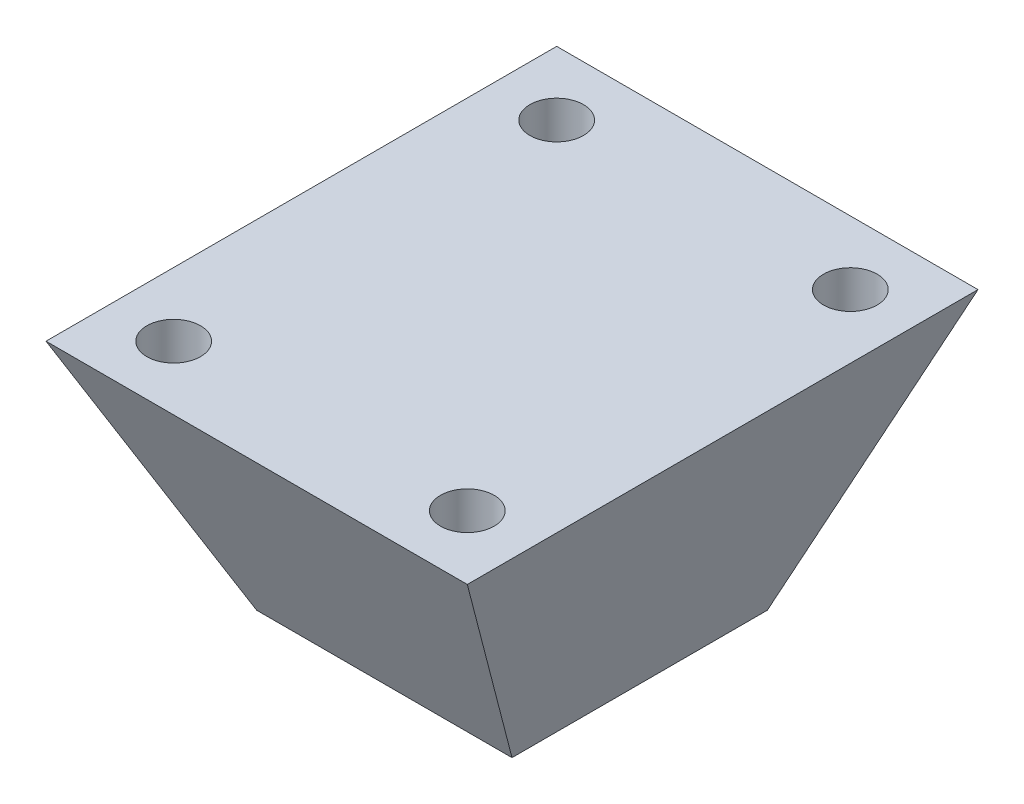
ISO-10303-21;
HEADER;
FILE_DESCRIPTION(('STEP AP214'),'2;1');
FILE_NAME('part.step','',(''),(''),'','','');
FILE_SCHEMA(('AUTOMOTIVE_DESIGN { 1 0 10303 214 1 1 1 1 }'));
ENDSEC;
DATA;
#1=APPLICATION_CONTEXT('core data for automotive mechanical design processes');
#2=APPLICATION_PROTOCOL_DEFINITION('international standard','automotive_design',2000,#1);
#3=PRODUCT_CONTEXT('',#1,'mechanical');
#4=PRODUCT('Part','Part','',(#3));
#5=PRODUCT_RELATED_PRODUCT_CATEGORY('part','',(#4));
#6=PRODUCT_DEFINITION_FORMATION('','',#4);
#7=PRODUCT_DEFINITION_CONTEXT('part definition',#1,'design');
#8=PRODUCT_DEFINITION('design','',#6,#7);
#9=PRODUCT_DEFINITION_SHAPE('','',#8);
#10=(LENGTH_UNIT() NAMED_UNIT(*) SI_UNIT(.MILLI.,.METRE.));
#11=(NAMED_UNIT(*) PLANE_ANGLE_UNIT() SI_UNIT($,.RADIAN.));
#12=(NAMED_UNIT(*) SI_UNIT($,.STERADIAN.) SOLID_ANGLE_UNIT());
#13=UNCERTAINTY_MEASURE_WITH_UNIT(LENGTH_MEASURE(1.E-05),#10,'distance_accuracy_value','');
#14=(GEOMETRIC_REPRESENTATION_CONTEXT(3) GLOBAL_UNCERTAINTY_ASSIGNED_CONTEXT((#13)) GLOBAL_UNIT_ASSIGNED_CONTEXT((#10,
#11,#12)) REPRESENTATION_CONTEXT('',''));
#15=CARTESIAN_POINT('',(0.,0.,0.));
#16=DIRECTION('',(0.,0.,1.));
#17=DIRECTION('',(1.,0.,0.));
#18=AXIS2_PLACEMENT_3D('',#15,#16,#17);
#19=CARTESIAN_POINT('',(0.,0.,0.));
#20=DIRECTION('',(0.,1.,0.));
#21=DIRECTION('',(0.,0.,1.));
#22=AXIS2_PLACEMENT_3D('',#19,#20,#21);
#23=PLANE('',#22);
#24=CARTESIAN_POINT('',(4.99999999999999,0.,-5.));
#25=DIRECTION('',(0.,1.,0.));
#26=DIRECTION('',(0.,0.,1.));
#27=AXIS2_PLACEMENT_3D('',#24,#25,#26);
#28=CIRCLE('',#27,2.1);
#29=CARTESIAN_POINT('',(4.99999999999999,0.,-2.9));
#30=VERTEX_POINT('',#29);
#31=EDGE_CURVE('E134',#30,#30,#28,.F.);
#32=ORIENTED_EDGE('',*,*,#31,.F.);
#33=EDGE_LOOP('',(#32));
#34=FACE_BOUND('',#33,.T.);
#35=CARTESIAN_POINT('',(-5.,0.,-5.));
#36=DIRECTION('',(0.,1.,0.));
#37=DIRECTION('',(0.,0.,1.));
#38=AXIS2_PLACEMENT_3D('',#35,#36,#37);
#39=CIRCLE('',#38,2.1);
#40=CARTESIAN_POINT('',(-5.,0.,-2.9));
#41=VERTEX_POINT('',#40);
#42=EDGE_CURVE('E115',#41,#41,#39,.T.);
#43=ORIENTED_EDGE('',*,*,#42,.T.);
#44=EDGE_LOOP('',(#43));
#45=FACE_BOUND('',#44,.T.);
#46=DIRECTION('',(0.,0.,1.));
#47=VECTOR('',#46,1.);
#48=CARTESIAN_POINT('',(-10.,0.,0.));
#49=LINE('',#48,#47);
#50=CARTESIAN_POINT('',(-10.,0.,-10.));
#51=VERTEX_POINT('',#50);
#52=CARTESIAN_POINT('',(-10.,0.,10.));
#53=VERTEX_POINT('',#52);
#54=EDGE_CURVE('E51',#51,#53,#49,.T.);
#55=ORIENTED_EDGE('',*,*,#54,.F.);
#56=DIRECTION('',(1.,0.,0.));
#57=VECTOR('',#56,1.);
#58=CARTESIAN_POINT('',(0.,0.,-10.));
#59=LINE('',#58,#57);
#60=CARTESIAN_POINT('',(10.,0.,-10.));
#61=VERTEX_POINT('',#60);
#62=EDGE_CURVE('E92',#51,#61,#59,.T.);
#63=ORIENTED_EDGE('',*,*,#62,.T.);
#64=DIRECTION('',(0.,0.,-1.));
#65=VECTOR('',#64,1.);
#66=CARTESIAN_POINT('',(10.,0.,0.));
#67=LINE('',#66,#65);
#68=CARTESIAN_POINT('',(10.,0.,10.));
#69=VERTEX_POINT('',#68);
#70=EDGE_CURVE('E89',#69,#61,#67,.T.);
#71=ORIENTED_EDGE('',*,*,#70,.F.);
#72=DIRECTION('',(-1.,0.,0.));
#73=VECTOR('',#72,1.);
#74=CARTESIAN_POINT('',(0.,0.,10.));
#75=LINE('',#74,#73);
#76=EDGE_CURVE('E58',#69,#53,#75,.T.);
#77=ORIENTED_EDGE('',*,*,#76,.T.);
#78=EDGE_LOOP('',(#55,#63,#71,#77));
#79=FACE_BOUND('',#78,.T.);
#80=CARTESIAN_POINT('',(5.,0.,5.));
#81=DIRECTION('',(0.,1.,0.));
#82=DIRECTION('',(0.,0.,1.));
#83=AXIS2_PLACEMENT_3D('',#80,#81,#82);
#84=CIRCLE('',#83,2.1);
#85=CARTESIAN_POINT('',(5.,0.,7.1));
#86=VERTEX_POINT('',#85);
#87=EDGE_CURVE('E128',#86,#86,#84,.T.);
#88=ORIENTED_EDGE('',*,*,#87,.T.);
#89=EDGE_LOOP('',(#88));
#90=FACE_BOUND('',#89,.T.);
#91=CARTESIAN_POINT('',(-5.,0.,5.));
#92=DIRECTION('',(0.,1.,0.));
#93=DIRECTION('',(0.,0.,1.));
#94=AXIS2_PLACEMENT_3D('',#91,#92,#93);
#95=CIRCLE('',#94,2.1);
#96=CARTESIAN_POINT('',(-5.,0.,7.1));
#97=VERTEX_POINT('',#96);
#98=EDGE_CURVE('E121',#97,#97,#95,.F.);
#99=ORIENTED_EDGE('',*,*,#98,.F.);
#100=EDGE_LOOP('',(#99));
#101=FACE_BOUND('',#100,.T.);
#102=ADVANCED_FACE('F37',(#34,#45,#79,#90,#101),#23,.F.);
#103=CARTESIAN_POINT('',(0.,-4.,-8.));
#104=DIRECTION('',(0.,0.447213595499958,0.894427190999916));
#105=DIRECTION('',(0.,-0.894427190999916,0.447213595499958));
#106=AXIS2_PLACEMENT_3D('',#103,#104,#105);
#107=PLANE('',#106);
#108=DIRECTION('',(0.279134538107027,-0.858875501867774,0.429437750933887));
#109=VECTOR('',#108,1.);
#110=CARTESIAN_POINT('',(-8.02213001383125,-6.08575380359613,-6.95712309820194));
#111=LINE('',#110,#109);
#112=CARTESIAN_POINT('',(-16.5,20.,-20.));
#113=VERTEX_POINT('',#112);
#114=EDGE_CURVE('E109',#113,#51,#111,.T.);
#115=ORIENTED_EDGE('',*,*,#114,.F.);
#116=DIRECTION('',(1.,0.,0.));
#117=VECTOR('',#116,1.);
#118=CARTESIAN_POINT('',(0.,20.,-20.));
#119=LINE('',#118,#117);
#120=CARTESIAN_POINT('',(16.5,20.,-20.));
#121=VERTEX_POINT('',#120);
#122=EDGE_CURVE('E88',#113,#121,#119,.T.);
#123=ORIENTED_EDGE('',*,*,#122,.T.);
#124=DIRECTION('',(-0.279134538107027,-0.858875501867774,0.429437750933887));
#125=VECTOR('',#124,1.);
#126=CARTESIAN_POINT('',(8.02213001383125,-6.08575380359613,-6.95712309820194));
#127=LINE('',#126,#125);
#128=EDGE_CURVE('E98',#121,#61,#127,.T.);
#129=ORIENTED_EDGE('',*,*,#128,.T.);
#130=ORIENTED_EDGE('',*,*,#62,.F.);
#131=EDGE_LOOP('',(#115,#123,#129,#130));
#132=FACE_BOUND('',#131,.T.);
#133=ADVANCED_FACE('F103',(#132),#107,.F.);
#134=CARTESIAN_POINT('',(0.,-4.,8.));
#135=DIRECTION('',(0.,0.447213595499958,-0.894427190999916));
#136=DIRECTION('',(0.,-0.894427190999916,-0.447213595499958));
#137=AXIS2_PLACEMENT_3D('',#134,#135,#136);
#138=PLANE('',#137);
#139=DIRECTION('',(-0.279134538107027,0.858875501867774,0.429437750933887));
#140=VECTOR('',#139,1.);
#141=CARTESIAN_POINT('',(-8.02213001383126,-6.08575380359613,6.95712309820193));
#142=LINE('',#141,#140);
#143=CARTESIAN_POINT('',(-16.5,20.,20.));
#144=VERTEX_POINT('',#143);
#145=EDGE_CURVE('E11',#53,#144,#142,.T.);
#146=ORIENTED_EDGE('',*,*,#145,.F.);
#147=ORIENTED_EDGE('',*,*,#76,.F.);
#148=DIRECTION('',(0.279134538107027,0.858875501867774,0.429437750933887));
#149=VECTOR('',#148,1.);
#150=CARTESIAN_POINT('',(8.02213001383126,-6.08575380359613,6.95712309820194));
#151=LINE('',#150,#149);
#152=CARTESIAN_POINT('',(16.5,20.,20.));
#153=VERTEX_POINT('',#152);
#154=EDGE_CURVE('E45',#69,#153,#151,.T.);
#155=ORIENTED_EDGE('',*,*,#154,.T.);
#156=DIRECTION('',(1.,0.,0.));
#157=VECTOR('',#156,1.);
#158=CARTESIAN_POINT('',(0.,20.,20.));
#159=LINE('',#158,#157);
#160=EDGE_CURVE('E80',#144,#153,#159,.T.);
#161=ORIENTED_EDGE('',*,*,#160,.F.);
#162=EDGE_LOOP('',(#146,#147,#155,#161));
#163=FACE_BOUND('',#162,.T.);
#164=ADVANCED_FACE('F81',(#163),#138,.F.);
#165=CARTESIAN_POINT('',(0.,20.,0.));
#166=DIRECTION('',(0.,1.,0.));
#167=DIRECTION('',(0.,0.,1.));
#168=AXIS2_PLACEMENT_3D('',#165,#166,#167);
#169=PLANE('',#168);
#170=CARTESIAN_POINT('',(11.5,20.,-15.));
#171=DIRECTION('',(0.,1.,0.));
#172=DIRECTION('',(0.,0.,-1.));
#173=AXIS2_PLACEMENT_3D('',#170,#171,#172);
#174=CIRCLE('',#173,2.1);
#175=CARTESIAN_POINT('',(11.5,20.,-17.1));
#176=VERTEX_POINT('',#175);
#177=EDGE_CURVE('E148',#176,#176,#174,.T.);
#178=ORIENTED_EDGE('',*,*,#177,.F.);
#179=EDGE_LOOP('',(#178));
#180=FACE_BOUND('',#179,.T.);
#181=CARTESIAN_POINT('',(11.5,20.,15.));
#182=DIRECTION('',(0.,1.,0.));
#183=DIRECTION('',(0.,0.,1.));
#184=AXIS2_PLACEMENT_3D('',#181,#182,#183);
#185=CIRCLE('',#184,2.1);
#186=CARTESIAN_POINT('',(11.5,20.,17.1));
#187=VERTEX_POINT('',#186);
#188=EDGE_CURVE('E154',#187,#187,#185,.T.);
#189=ORIENTED_EDGE('',*,*,#188,.F.);
#190=EDGE_LOOP('',(#189));
#191=FACE_BOUND('',#190,.T.);
#192=CARTESIAN_POINT('',(-11.5,20.,15.));
#193=DIRECTION('',(0.,1.,0.));
#194=DIRECTION('',(0.,0.,-1.));
#195=AXIS2_PLACEMENT_3D('',#192,#193,#194);
#196=CIRCLE('',#195,2.1);
#197=CARTESIAN_POINT('',(-11.5,20.,12.9));
#198=VERTEX_POINT('',#197);
#199=EDGE_CURVE('E142',#198,#198,#196,.T.);
#200=ORIENTED_EDGE('',*,*,#199,.F.);
#201=EDGE_LOOP('',(#200));
#202=FACE_BOUND('',#201,.T.);
#203=CARTESIAN_POINT('',(-11.5,20.,-15.));
#204=DIRECTION('',(0.,1.,0.));
#205=DIRECTION('',(0.,0.,1.));
#206=AXIS2_PLACEMENT_3D('',#203,#204,#205);
#207=CIRCLE('',#206,2.1);
#208=CARTESIAN_POINT('',(-11.5,20.,-12.9));
#209=VERTEX_POINT('',#208);
#210=EDGE_CURVE('E139',#209,#209,#207,.T.);
#211=ORIENTED_EDGE('',*,*,#210,.F.);
#212=EDGE_LOOP('',(#211));
#213=FACE_BOUND('',#212,.T.);
#214=DIRECTION('',(0.,0.,1.));
#215=VECTOR('',#214,1.);
#216=CARTESIAN_POINT('',(-16.5,20.,0.));
#217=LINE('',#216,#215);
#218=EDGE_CURVE('E77',#113,#144,#217,.T.);
#219=ORIENTED_EDGE('',*,*,#218,.T.);
#220=ORIENTED_EDGE('',*,*,#160,.T.);
#221=DIRECTION('',(0.,0.,1.));
#222=VECTOR('',#221,1.);
#223=CARTESIAN_POINT('',(16.5,20.,0.));
#224=LINE('',#223,#222);
#225=EDGE_CURVE('E85',#121,#153,#224,.T.);
#226=ORIENTED_EDGE('',*,*,#225,.F.);
#227=ORIENTED_EDGE('',*,*,#122,.F.);
#228=EDGE_LOOP('',(#219,#220,#226,#227));
#229=FACE_BOUND('',#228,.T.);
#230=ADVANCED_FACE('F39',(#180,#191,#202,#213,#229),#169,.T.);
#231=CARTESIAN_POINT('',(9.04465799886941,-2.93951384963257,0.));
#232=DIRECTION('',(0.951034068730948,-0.309086072337559,0.));
#233=DIRECTION('',(0.309086072337559,0.951034068730948,0.));
#234=AXIS2_PLACEMENT_3D('',#231,#232,#233);
#235=PLANE('',#234);
#236=ORIENTED_EDGE('',*,*,#154,.F.);
#237=ORIENTED_EDGE('',*,*,#70,.T.);
#238=ORIENTED_EDGE('',*,*,#128,.F.);
#239=ORIENTED_EDGE('',*,*,#225,.T.);
#240=EDGE_LOOP('',(#236,#237,#238,#239));
#241=FACE_BOUND('',#240,.T.);
#242=ADVANCED_FACE('F105',(#241),#235,.T.);
#243=CARTESIAN_POINT('',(-9.04465799886941,-2.93951384963257,0.));
#244=DIRECTION('',(-0.951034068730948,-0.309086072337559,0.));
#245=DIRECTION('',(-0.309086072337559,0.951034068730948,0.));
#246=AXIS2_PLACEMENT_3D('',#243,#244,#245);
#247=PLANE('',#246);
#248=ORIENTED_EDGE('',*,*,#114,.T.);
#249=ORIENTED_EDGE('',*,*,#54,.T.);
#250=ORIENTED_EDGE('',*,*,#145,.T.);
#251=ORIENTED_EDGE('',*,*,#218,.F.);
#252=EDGE_LOOP('',(#248,#249,#250,#251));
#253=FACE_BOUND('',#252,.T.);
#254=ADVANCED_FACE('F75',(#253),#247,.T.);
#255=CARTESIAN_POINT('',(-5.,5.7,-5.));
#256=DIRECTION('',(0.,-1.,0.));
#257=DIRECTION('',(0.,0.,-1.));
#258=AXIS2_PLACEMENT_3D('',#255,#256,#257);
#259=CYLINDRICAL_SURFACE('',#258,2.1);
#260=CARTESIAN_POINT('',(-5.,5.7,-5.));
#261=DIRECTION('',(0.,1.,0.));
#262=DIRECTION('',(0.,0.,1.));
#263=AXIS2_PLACEMENT_3D('',#260,#261,#262);
#264=CIRCLE('',#263,2.1);
#265=CARTESIAN_POINT('',(-5.,5.7,-2.9));
#266=VERTEX_POINT('',#265);
#267=EDGE_CURVE('E114',#266,#266,#264,.T.);
#268=ORIENTED_EDGE('',*,*,#267,.T.);
#269=EDGE_LOOP('',(#268));
#270=FACE_BOUND('',#269,.T.);
#271=ORIENTED_EDGE('',*,*,#42,.F.);
#272=EDGE_LOOP('',(#271));
#273=FACE_BOUND('',#272,.T.);
#274=ADVANCED_FACE('F202',(#270,#273),#259,.F.);
#275=CARTESIAN_POINT('',(0.,5.7,0.));
#276=DIRECTION('',(0.,1.,0.));
#277=DIRECTION('',(0.,0.,1.));
#278=AXIS2_PLACEMENT_3D('',#275,#276,#277);
#279=PLANE('',#278);
#280=ORIENTED_EDGE('',*,*,#267,.F.);
#281=EDGE_LOOP('',(#280));
#282=FACE_BOUND('',#281,.T.);
#283=ADVANCED_FACE('F205',(#282),#279,.F.);
#284=CARTESIAN_POINT('',(4.99999999999999,5.7,-5.));
#285=DIRECTION('',(0.,-1.,0.));
#286=DIRECTION('',(0.,0.,-1.));
#287=AXIS2_PLACEMENT_3D('',#284,#285,#286);
#288=CYLINDRICAL_SURFACE('',#287,2.1);
#289=CARTESIAN_POINT('',(4.99999999999999,5.7,-5.));
#290=DIRECTION('',(0.,1.,0.));
#291=DIRECTION('',(0.,0.,1.));
#292=AXIS2_PLACEMENT_3D('',#289,#290,#291);
#293=CIRCLE('',#292,2.1);
#294=CARTESIAN_POINT('',(4.99999999999999,5.7,-2.9));
#295=VERTEX_POINT('',#294);
#296=EDGE_CURVE('E118',#295,#295,#293,.F.);
#297=ORIENTED_EDGE('',*,*,#296,.F.);
#298=EDGE_LOOP('',(#297));
#299=FACE_BOUND('',#298,.T.);
#300=ORIENTED_EDGE('',*,*,#31,.T.);
#301=EDGE_LOOP('',(#300));
#302=FACE_BOUND('',#301,.T.);
#303=ADVANCED_FACE('F209',(#299,#302),#288,.F.);
#304=CARTESIAN_POINT('',(0.,5.7,0.));
#305=DIRECTION('',(0.,1.,0.));
#306=DIRECTION('',(0.,0.,1.));
#307=AXIS2_PLACEMENT_3D('',#304,#305,#306);
#308=PLANE('',#307);
#309=ORIENTED_EDGE('',*,*,#296,.T.);
#310=EDGE_LOOP('',(#309));
#311=FACE_BOUND('',#310,.T.);
#312=ADVANCED_FACE('F218',(#311),#308,.F.);
#313=CARTESIAN_POINT('',(5.,5.7,5.));
#314=DIRECTION('',(0.,-1.,0.));
#315=DIRECTION('',(0.,0.,-1.));
#316=AXIS2_PLACEMENT_3D('',#313,#314,#315);
#317=CYLINDRICAL_SURFACE('',#316,2.1);
#318=CARTESIAN_POINT('',(5.,5.7,5.));
#319=DIRECTION('',(0.,1.,0.));
#320=DIRECTION('',(0.,0.,1.));
#321=AXIS2_PLACEMENT_3D('',#318,#319,#320);
#322=CIRCLE('',#321,2.1);
#323=CARTESIAN_POINT('',(5.,5.7,7.1));
#324=VERTEX_POINT('',#323);
#325=EDGE_CURVE('E131',#324,#324,#322,.T.);
#326=ORIENTED_EDGE('',*,*,#325,.T.);
#327=EDGE_LOOP('',(#326));
#328=FACE_BOUND('',#327,.T.);
#329=ORIENTED_EDGE('',*,*,#87,.F.);
#330=EDGE_LOOP('',(#329));
#331=FACE_BOUND('',#330,.T.);
#332=ADVANCED_FACE('F215',(#328,#331),#317,.F.);
#333=CARTESIAN_POINT('',(0.,5.7,0.));
#334=DIRECTION('',(0.,1.,0.));
#335=DIRECTION('',(0.,0.,1.));
#336=AXIS2_PLACEMENT_3D('',#333,#334,#335);
#337=PLANE('',#336);
#338=ORIENTED_EDGE('',*,*,#325,.F.);
#339=EDGE_LOOP('',(#338));
#340=FACE_BOUND('',#339,.T.);
#341=ADVANCED_FACE('F212',(#340),#337,.F.);
#342=CARTESIAN_POINT('',(-5.,5.7,5.));
#343=DIRECTION('',(0.,-1.,0.));
#344=DIRECTION('',(0.,0.,-1.));
#345=AXIS2_PLACEMENT_3D('',#342,#343,#344);
#346=CYLINDRICAL_SURFACE('',#345,2.1);
#347=CARTESIAN_POINT('',(-5.,5.7,5.));
#348=DIRECTION('',(0.,1.,0.));
#349=DIRECTION('',(0.,0.,1.));
#350=AXIS2_PLACEMENT_3D('',#347,#348,#349);
#351=CIRCLE('',#350,2.1);
#352=CARTESIAN_POINT('',(-5.,5.7,7.1));
#353=VERTEX_POINT('',#352);
#354=EDGE_CURVE('E124',#353,#353,#351,.F.);
#355=ORIENTED_EDGE('',*,*,#354,.F.);
#356=EDGE_LOOP('',(#355));
#357=FACE_BOUND('',#356,.T.);
#358=ORIENTED_EDGE('',*,*,#98,.T.);
#359=EDGE_LOOP('',(#358));
#360=FACE_BOUND('',#359,.T.);
#361=ADVANCED_FACE('F182',(#357,#360),#346,.F.);
#362=CARTESIAN_POINT('',(0.,5.7,0.));
#363=DIRECTION('',(0.,1.,0.));
#364=DIRECTION('',(0.,0.,1.));
#365=AXIS2_PLACEMENT_3D('',#362,#363,#364);
#366=PLANE('',#365);
#367=ORIENTED_EDGE('',*,*,#354,.T.);
#368=EDGE_LOOP('',(#367));
#369=FACE_BOUND('',#368,.T.);
#370=ADVANCED_FACE('F173',(#369),#366,.F.);
#371=CARTESIAN_POINT('',(-11.5,14.3,-15.));
#372=DIRECTION('',(0.,1.,0.));
#373=DIRECTION('',(0.,0.,1.));
#374=AXIS2_PLACEMENT_3D('',#371,#372,#373);
#375=CYLINDRICAL_SURFACE('',#374,2.1);
#376=CARTESIAN_POINT('',(-11.5,14.3,-15.));
#377=DIRECTION('',(0.,1.,0.));
#378=DIRECTION('',(0.,0.,1.));
#379=AXIS2_PLACEMENT_3D('',#376,#377,#378);
#380=CIRCLE('',#379,2.1);
#381=CARTESIAN_POINT('',(-11.5,14.3,-12.9));
#382=VERTEX_POINT('',#381);
#383=EDGE_CURVE('E125',#382,#382,#380,.T.);
#384=ORIENTED_EDGE('',*,*,#383,.F.);
#385=EDGE_LOOP('',(#384));
#386=FACE_BOUND('',#385,.T.);
#387=ORIENTED_EDGE('',*,*,#210,.T.);
#388=EDGE_LOOP('',(#387));
#389=FACE_BOUND('',#388,.T.);
#390=ADVANCED_FACE('F170',(#386,#389),#375,.F.);
#391=CARTESIAN_POINT('',(-11.5,14.3,-15.));
#392=DIRECTION('',(0.,1.,0.));
#393=DIRECTION('',(0.,0.,1.));
#394=AXIS2_PLACEMENT_3D('',#391,#392,#393);
#395=PLANE('',#394);
#396=ORIENTED_EDGE('',*,*,#383,.T.);
#397=EDGE_LOOP('',(#396));
#398=FACE_BOUND('',#397,.T.);
#399=ADVANCED_FACE('F172',(#398),#395,.T.);
#400=CARTESIAN_POINT('',(-11.5,14.3,15.));
#401=DIRECTION('',(0.,1.,0.));
#402=DIRECTION('',(0.,0.,1.));
#403=AXIS2_PLACEMENT_3D('',#400,#401,#402);
#404=CYLINDRICAL_SURFACE('',#403,2.1);
#405=CARTESIAN_POINT('',(-11.5,14.3,15.));
#406=DIRECTION('',(0.,1.,0.));
#407=DIRECTION('',(0.,0.,-1.));
#408=AXIS2_PLACEMENT_3D('',#405,#406,#407);
#409=CIRCLE('',#408,2.1);
#410=CARTESIAN_POINT('',(-11.5,14.3,12.9));
#411=VERTEX_POINT('',#410);
#412=EDGE_CURVE('E157',#411,#411,#409,.T.);
#413=ORIENTED_EDGE('',*,*,#412,.F.);
#414=EDGE_LOOP('',(#413));
#415=FACE_BOUND('',#414,.T.);
#416=ORIENTED_EDGE('',*,*,#199,.T.);
#417=EDGE_LOOP('',(#416));
#418=FACE_BOUND('',#417,.T.);
#419=ADVANCED_FACE('F163',(#415,#418),#404,.F.);
#420=CARTESIAN_POINT('',(-11.5,14.3,15.));
#421=DIRECTION('',(0.,-1.,0.));
#422=DIRECTION('',(0.,0.,-1.));
#423=AXIS2_PLACEMENT_3D('',#420,#421,#422);
#424=PLANE('',#423);
#425=ORIENTED_EDGE('',*,*,#412,.T.);
#426=EDGE_LOOP('',(#425));
#427=FACE_BOUND('',#426,.T.);
#428=ADVANCED_FACE('F279',(#427),#424,.F.);
#429=CARTESIAN_POINT('',(11.5,14.3,15.));
#430=DIRECTION('',(0.,1.,0.));
#431=DIRECTION('',(0.,0.,1.));
#432=AXIS2_PLACEMENT_3D('',#429,#430,#431);
#433=CYLINDRICAL_SURFACE('',#432,2.1);
#434=CARTESIAN_POINT('',(11.5,14.3,15.));
#435=DIRECTION('',(0.,1.,0.));
#436=DIRECTION('',(0.,0.,1.));
#437=AXIS2_PLACEMENT_3D('',#434,#435,#436);
#438=CIRCLE('',#437,2.1);
#439=CARTESIAN_POINT('',(11.5,14.3,17.1));
#440=VERTEX_POINT('',#439);
#441=EDGE_CURVE('E151',#440,#440,#438,.T.);
#442=ORIENTED_EDGE('',*,*,#441,.F.);
#443=EDGE_LOOP('',(#442));
#444=FACE_BOUND('',#443,.T.);
#445=ORIENTED_EDGE('',*,*,#188,.T.);
#446=EDGE_LOOP('',(#445));
#447=FACE_BOUND('',#446,.T.);
#448=ADVANCED_FACE('F290',(#444,#447),#433,.F.);
#449=CARTESIAN_POINT('',(11.5,14.3,15.));
#450=DIRECTION('',(0.,1.,0.));
#451=DIRECTION('',(0.,0.,1.));
#452=AXIS2_PLACEMENT_3D('',#449,#450,#451);
#453=PLANE('',#452);
#454=ORIENTED_EDGE('',*,*,#441,.T.);
#455=EDGE_LOOP('',(#454));
#456=FACE_BOUND('',#455,.T.);
#457=ADVANCED_FACE('F301',(#456),#453,.T.);
#458=CARTESIAN_POINT('',(11.5,14.3,-15.));
#459=DIRECTION('',(0.,1.,0.));
#460=DIRECTION('',(0.,0.,1.));
#461=AXIS2_PLACEMENT_3D('',#458,#459,#460);
#462=CYLINDRICAL_SURFACE('',#461,2.1);
#463=CARTESIAN_POINT('',(11.5,14.3,-15.));
#464=DIRECTION('',(0.,1.,0.));
#465=DIRECTION('',(0.,0.,-1.));
#466=AXIS2_PLACEMENT_3D('',#463,#464,#465);
#467=CIRCLE('',#466,2.1);
#468=CARTESIAN_POINT('',(11.5,14.3,-17.1));
#469=VERTEX_POINT('',#468);
#470=EDGE_CURVE('E145',#469,#469,#467,.T.);
#471=ORIENTED_EDGE('',*,*,#470,.F.);
#472=EDGE_LOOP('',(#471));
#473=FACE_BOUND('',#472,.T.);
#474=ORIENTED_EDGE('',*,*,#177,.T.);
#475=EDGE_LOOP('',(#474));
#476=FACE_BOUND('',#475,.T.);
#477=ADVANCED_FACE('F312',(#473,#476),#462,.F.);
#478=CARTESIAN_POINT('',(11.5,14.3,-15.));
#479=DIRECTION('',(0.,-1.,0.));
#480=DIRECTION('',(0.,0.,-1.));
#481=AXIS2_PLACEMENT_3D('',#478,#479,#480);
#482=PLANE('',#481);
#483=ORIENTED_EDGE('',*,*,#470,.T.);
#484=EDGE_LOOP('',(#483));
#485=FACE_BOUND('',#484,.T.);
#486=ADVANCED_FACE('F323',(#485),#482,.F.);
#487=CLOSED_SHELL('',(#102,#133,#164,#230,#242,#254,#274,#283,#303,#312,#332,#341,#361,#370,
#390,#399,#419,#428,#448,#457,#477,#486));
#488=MANIFOLD_SOLID_BREP('B2',#487);
#489=ADVANCED_BREP_SHAPE_REPRESENTATION('',(#18,#488),#14);
#490=SHAPE_DEFINITION_REPRESENTATION(#9,#489);
ENDSEC;
END-ISO-10303-21;
